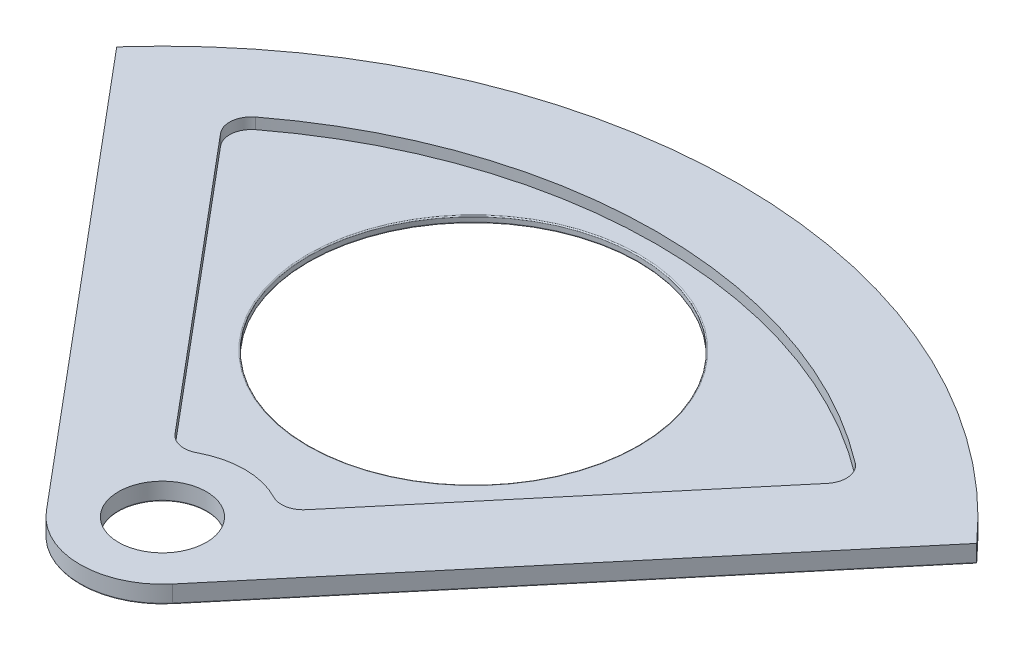
ISO-10303-21;
HEADER;
FILE_DESCRIPTION(('STEP AP214'),'2;1');
FILE_NAME('part.step','',(''),(''),'','','');
FILE_SCHEMA(('AUTOMOTIVE_DESIGN { 1 0 10303 214 1 1 1 1 }'));
ENDSEC;
DATA;
#1=APPLICATION_CONTEXT('core data for automotive mechanical design processes');
#2=APPLICATION_PROTOCOL_DEFINITION('international standard','automotive_design',2000,#1);
#3=PRODUCT_CONTEXT('',#1,'mechanical');
#4=PRODUCT('Part','Part','',(#3));
#5=PRODUCT_RELATED_PRODUCT_CATEGORY('part','',(#4));
#6=PRODUCT_DEFINITION_FORMATION('','',#4);
#7=PRODUCT_DEFINITION_CONTEXT('part definition',#1,'design');
#8=PRODUCT_DEFINITION('design','',#6,#7);
#9=PRODUCT_DEFINITION_SHAPE('','',#8);
#10=(LENGTH_UNIT() NAMED_UNIT(*) SI_UNIT(.MILLI.,.METRE.));
#11=(NAMED_UNIT(*) PLANE_ANGLE_UNIT() SI_UNIT($,.RADIAN.));
#12=(NAMED_UNIT(*) SI_UNIT($,.STERADIAN.) SOLID_ANGLE_UNIT());
#13=UNCERTAINTY_MEASURE_WITH_UNIT(LENGTH_MEASURE(1.E-05),#10,'distance_accuracy_value','');
#14=(GEOMETRIC_REPRESENTATION_CONTEXT(3) GLOBAL_UNCERTAINTY_ASSIGNED_CONTEXT((#13)) GLOBAL_UNIT_ASSIGNED_CONTEXT((#10,
#11,#12)) REPRESENTATION_CONTEXT('',''));
#15=CARTESIAN_POINT('',(0.,0.,0.));
#16=DIRECTION('',(0.,0.,1.));
#17=DIRECTION('',(1.,0.,0.));
#18=AXIS2_PLACEMENT_3D('',#15,#16,#17);
#19=CARTESIAN_POINT('',(-5.55111512312578E-13,2.54,0.));
#20=DIRECTION('',(0.,1.,0.));
#21=DIRECTION('',(0.,0.,1.));
#22=AXIS2_PLACEMENT_3D('',#19,#20,#21);
#23=PLANE('',#22);
#24=DIRECTION('',(0.642787609686541,0.,-0.766044443118977));
#25=VECTOR('',#24,1.);
#26=CARTESIAN_POINT('',(12.2451039645272,2.53999999999895,-14.5931466414165));
#27=LINE('',#26,#25);
#28=CARTESIAN_POINT('',(15.1628474356427,2.54000000000008,-18.070377905385));
#29=VERTEX_POINT('',#28);
#30=CARTESIAN_POINT('',(70.1292829861336,2.53999999999803,-83.5768249447815));
#31=VERTEX_POINT('',#30);
#32=EDGE_CURVE('E372',#29,#31,#27,.T.);
#33=ORIENTED_EDGE('',*,*,#32,.F.);
#34=CARTESIAN_POINT('',(11.2713416645972,2.53999999999958,-21.3357389625926));
#35=DIRECTION('',(0.,1.,0.));
#36=DIRECTION('',(0.,0.,1.));
#37=AXIS2_PLACEMENT_3D('',#34,#35,#36);
#38=CIRCLE('',#37,5.08);
#39=CARTESIAN_POINT('',(8.89842762994542,2.5399999999996,-16.844004444152));
#40=VERTEX_POINT('',#39);
#41=EDGE_CURVE('E342',#29,#40,#38,.F.);
#42=ORIENTED_EDGE('',*,*,#41,.T.);
#43=CARTESIAN_POINT('',(-5.55111512312578E-13,2.54,0.));
#44=DIRECTION('',(0.,-1.,0.));
#45=DIRECTION('',(0.,0.,1.));
#46=AXIS2_PLACEMENT_3D('',#43,#44,#45);
#47=CIRCLE('',#46,19.05);
#48=CARTESIAN_POINT('',(-8.89842762994653,2.54000000000014,-16.844004444152));
#49=VERTEX_POINT('',#48);
#50=EDGE_CURVE('E168',#49,#40,#47,.T.);
#51=ORIENTED_EDGE('',*,*,#50,.F.);
#52=CARTESIAN_POINT('',(-11.2713416645993,2.54000000000067,-21.3357389625927));
#53=DIRECTION('',(0.,1.,0.));
#54=DIRECTION('',(0.,0.,1.));
#55=AXIS2_PLACEMENT_3D('',#52,#53,#54);
#56=CIRCLE('',#55,5.08);
#57=CARTESIAN_POINT('',(-15.1628474356432,2.54000000000056,-18.0703779053851));
#58=VERTEX_POINT('',#57);
#59=EDGE_CURVE('E174',#49,#58,#56,.F.);
#60=ORIENTED_EDGE('',*,*,#59,.T.);
#61=DIRECTION('',(0.642787609686541,0.,0.766044443118977));
#62=VECTOR('',#61,1.);
#63=CARTESIAN_POINT('',(-12.24510396453,2.54000000000056,-14.5931466414165));
#64=LINE('',#63,#62);
#65=CARTESIAN_POINT('',(-70.1292829861355,2.54000000000344,-83.5768249447816));
#66=VERTEX_POINT('',#65);
#67=EDGE_CURVE('E371',#66,#58,#64,.T.);
#68=ORIENTED_EDGE('',*,*,#67,.F.);
#69=CARTESIAN_POINT('',(-66.2377772150904,2.54000000000344,-86.8421860019891));
#70=DIRECTION('',(0.,1.,0.));
#71=DIRECTION('',(0.,0.,1.));
#72=AXIS2_PLACEMENT_3D('',#69,#70,#71);
#73=CIRCLE('',#72,5.08);
#74=CARTESIAN_POINT('',(-69.3186040623036,2.54000000000346,-90.8813574439423));
#75=VERTEX_POINT('',#74);
#76=EDGE_CURVE('E154',#66,#75,#73,.F.);
#77=ORIENTED_EDGE('',*,*,#76,.T.);
#78=CARTESIAN_POINT('',(-5.55111512312578E-13,2.54,0.));
#79=DIRECTION('',(0.,1.,0.));
#80=DIRECTION('',(0.,0.,1.));
#81=AXIS2_PLACEMENT_3D('',#78,#79,#80);
#82=CIRCLE('',#81,114.3);
#83=CARTESIAN_POINT('',(69.3186040623035,2.53999999999804,-90.8813574439422));
#84=VERTEX_POINT('',#83);
#85=EDGE_CURVE('E369',#84,#75,#82,.T.);
#86=ORIENTED_EDGE('',*,*,#85,.F.);
#87=CARTESIAN_POINT('',(66.2377772150899,2.53999999999804,-86.8421860019891));
#88=DIRECTION('',(0.,1.,0.));
#89=DIRECTION('',(0.,0.,1.));
#90=AXIS2_PLACEMENT_3D('',#87,#88,#89);
#91=CIRCLE('',#90,5.08);
#92=EDGE_CURVE('E183',#84,#31,#91,.F.);
#93=ORIENTED_EDGE('',*,*,#92,.T.);
#94=EDGE_LOOP('',(#33,#42,#51,#60,#68,#77,#86,#93));
#95=FACE_BOUND('',#94,.T.);
#96=CARTESIAN_POINT('',(-5.55111512312578E-13,2.54,0.));
#97=DIRECTION('',(0.,1.,0.));
#98=DIRECTION('',(0.,0.,1.));
#99=AXIS2_PLACEMENT_3D('',#96,#97,#98);
#100=CIRCLE('',#99,19.05);
#101=CARTESIAN_POINT('',(-14.5931466414171,2.54000000000031,12.2451039645286));
#102=VERTEX_POINT('',#101);
#103=CARTESIAN_POINT('',(14.5931466414164,2.53999999999933,12.2451039645286));
#104=VERTEX_POINT('',#103);
#105=EDGE_CURVE('E374',#102,#104,#100,.T.);
#106=ORIENTED_EDGE('',*,*,#105,.T.);
#107=DIRECTION('',(0.642787609686541,0.,-0.766044443118977));
#108=VECTOR('',#107,1.);
#109=CARTESIAN_POINT('',(14.5931466414164,2.53999999999933,12.2451039645286));
#110=LINE('',#109,#108);
#111=CARTESIAN_POINT('',(99.429715483523,2.53999999999695,-88.8591817364174));
#112=VERTEX_POINT('',#111);
#113=EDGE_CURVE('E384',#104,#112,#110,.T.);
#114=ORIENTED_EDGE('',*,*,#113,.T.);
#115=CARTESIAN_POINT('',(-5.55111512312578E-13,2.54,0.));
#116=DIRECTION('',(0.,1.,0.));
#117=DIRECTION('',(0.,0.,-1.));
#118=AXIS2_PLACEMENT_3D('',#115,#116,#117);
#119=CIRCLE('',#118,133.35);
#120=CARTESIAN_POINT('',(-99.4297154835231,2.54000000000508,-88.8591817364174));
#121=VERTEX_POINT('',#120);
#122=EDGE_CURVE('E386',#112,#121,#119,.T.);
#123=ORIENTED_EDGE('',*,*,#122,.T.);
#124=DIRECTION('',(0.642787609686541,0.,0.766044443118977));
#125=VECTOR('',#124,1.);
#126=CARTESIAN_POINT('',(-14.5931466414171,2.54000000000031,12.2451039645286));
#127=LINE('',#126,#125);
#128=EDGE_CURVE('E388',#121,#102,#127,.T.);
#129=ORIENTED_EDGE('',*,*,#128,.T.);
#130=EDGE_LOOP('',(#106,#114,#123,#129));
#131=FACE_BOUND('',#130,.T.);
#132=CARTESIAN_POINT('',(-5.55111512312578E-13,2.54,0.));
#133=DIRECTION('',(0.,1.,0.));
#134=DIRECTION('',(0.,0.,1.));
#135=AXIS2_PLACEMENT_3D('',#132,#133,#134);
#136=CIRCLE('',#135,10.16);
#137=CARTESIAN_POINT('',(-5.55111512312579E-13,2.53999999999991,10.16));
#138=VERTEX_POINT('',#137);
#139=EDGE_CURVE('E379',#138,#138,#136,.T.);
#140=ORIENTED_EDGE('',*,*,#139,.F.);
#141=EDGE_LOOP('',(#140));
#142=FACE_BOUND('',#141,.T.);
#143=ADVANCED_FACE('F36',(#95,#131,#142),#23,.T.);
#144=CARTESIAN_POINT('',(-5.55111512312578E-13,2.54,0.));
#145=DIRECTION('',(0.,-1.,0.));
#146=DIRECTION('',(0.,0.,-1.));
#147=AXIS2_PLACEMENT_3D('',#144,#145,#146);
#148=CYLINDRICAL_SURFACE('',#147,19.05);
#149=DIRECTION('',(0.,-1.,0.));
#150=VECTOR('',#149,1.);
#151=CARTESIAN_POINT('',(-14.5931466414171,2.54000000000031,12.2451039645286));
#152=LINE('',#151,#150);
#153=CARTESIAN_POINT('',(-14.5931466414165,-1.2699999999997,12.2451039645286));
#154=VERTEX_POINT('',#153);
#155=EDGE_CURVE('E390',#102,#154,#152,.T.);
#156=ORIENTED_EDGE('',*,*,#155,.T.);
#157=CARTESIAN_POINT('',(0.,-1.26999999999999,-1.2490009027033E-13));
#158=DIRECTION('',(0.,-1.,0.));
#159=DIRECTION('',(1.,0.,0.));
#160=AXIS2_PLACEMENT_3D('',#157,#158,#159);
#161=CIRCLE('',#160,19.05);
#162=CARTESIAN_POINT('',(14.5931466414165,-1.27000000000066,12.2451039645286));
#163=VERTEX_POINT('',#162);
#164=EDGE_CURVE('E211',#154,#163,#161,.F.);
#165=ORIENTED_EDGE('',*,*,#164,.T.);
#166=DIRECTION('',(0.,-1.,0.));
#167=VECTOR('',#166,1.);
#168=CARTESIAN_POINT('',(14.5931466414164,2.53999999999933,12.2451039645286));
#169=LINE('',#168,#167);
#170=EDGE_CURVE('E357',#104,#163,#169,.T.);
#171=ORIENTED_EDGE('',*,*,#170,.F.);
#172=ORIENTED_EDGE('',*,*,#105,.F.);
#173=EDGE_LOOP('',(#156,#165,#171,#172));
#174=FACE_BOUND('',#173,.T.);
#175=ADVANCED_FACE('F250',(#174),#148,.T.);
#176=CARTESIAN_POINT('',(14.5931466414164,2.53999999999933,12.2451039645286));
#177=DIRECTION('',(-0.766044443118977,0.,-0.642787609686541));
#178=DIRECTION('',(-0.642787609686541,0.,0.766044443118977));
#179=AXIS2_PLACEMENT_3D('',#176,#177,#178);
#180=PLANE('',#179);
#181=ORIENTED_EDGE('',*,*,#170,.T.);
#182=DIRECTION('',(-0.642787609686541,0.,0.766044443118977));
#183=VECTOR('',#182,1.);
#184=CARTESIAN_POINT('',(99.429715483523,-1.27000000000306,-88.8591817364173));
#185=LINE('',#184,#183);
#186=CARTESIAN_POINT('',(99.429715483523,-1.27000000000306,-88.8591817364173));
#187=VERTEX_POINT('',#186);
#188=EDGE_CURVE('E206',#163,#187,#185,.F.);
#189=ORIENTED_EDGE('',*,*,#188,.T.);
#190=DIRECTION('',(0.,-1.,0.));
#191=VECTOR('',#190,1.);
#192=CARTESIAN_POINT('',(99.429715483523,2.53999999999695,-88.8591817364174));
#193=LINE('',#192,#191);
#194=EDGE_CURVE('E361',#112,#187,#193,.T.);
#195=ORIENTED_EDGE('',*,*,#194,.F.);
#196=ORIENTED_EDGE('',*,*,#113,.F.);
#197=EDGE_LOOP('',(#181,#189,#195,#196));
#198=FACE_BOUND('',#197,.T.);
#199=ADVANCED_FACE('F256',(#198),#180,.F.);
#200=CARTESIAN_POINT('',(-5.55111512312578E-13,2.54,0.));
#201=DIRECTION('',(0.,-1.,0.));
#202=DIRECTION('',(0.,0.,-1.));
#203=AXIS2_PLACEMENT_3D('',#200,#201,#202);
#204=CYLINDRICAL_SURFACE('',#203,133.35);
#205=ORIENTED_EDGE('',*,*,#194,.T.);
#206=CARTESIAN_POINT('',(0.,-1.26999999999999,-1.2490009027033E-13));
#207=DIRECTION('',(0.,-1.,0.));
#208=DIRECTION('',(1.,0.,0.));
#209=AXIS2_PLACEMENT_3D('',#206,#207,#208);
#210=CIRCLE('',#209,133.35);
#211=CARTESIAN_POINT('',(-99.4297154835231,-1.26999999999493,-88.8591817364173));
#212=VERTEX_POINT('',#211);
#213=EDGE_CURVE('E67',#187,#212,#210,.F.);
#214=ORIENTED_EDGE('',*,*,#213,.T.);
#215=DIRECTION('',(0.,-1.,0.));
#216=VECTOR('',#215,1.);
#217=CARTESIAN_POINT('',(-99.4297154835231,2.54000000000508,-88.8591817364174));
#218=LINE('',#217,#216);
#219=EDGE_CURVE('E392',#121,#212,#218,.T.);
#220=ORIENTED_EDGE('',*,*,#219,.F.);
#221=ORIENTED_EDGE('',*,*,#122,.F.);
#222=EDGE_LOOP('',(#205,#214,#220,#221));
#223=FACE_BOUND('',#222,.T.);
#224=ADVANCED_FACE('F268',(#223),#204,.T.);
#225=CARTESIAN_POINT('',(-14.5931466414171,2.54000000000031,12.2451039645286));
#226=DIRECTION('',(0.766044443118977,0.,-0.642787609686541));
#227=DIRECTION('',(-0.642787609686541,0.,-0.766044443118977));
#228=AXIS2_PLACEMENT_3D('',#225,#226,#227);
#229=PLANE('',#228);
#230=ORIENTED_EDGE('',*,*,#219,.T.);
#231=DIRECTION('',(-0.642787609686541,0.,-0.766044443118977));
#232=VECTOR('',#231,1.);
#233=CARTESIAN_POINT('',(-14.5931466414165,-1.2699999999997,12.2451039645286));
#234=LINE('',#233,#232);
#235=EDGE_CURVE('E59',#212,#154,#234,.F.);
#236=ORIENTED_EDGE('',*,*,#235,.T.);
#237=ORIENTED_EDGE('',*,*,#155,.F.);
#238=ORIENTED_EDGE('',*,*,#128,.F.);
#239=EDGE_LOOP('',(#230,#236,#237,#238));
#240=FACE_BOUND('',#239,.T.);
#241=ADVANCED_FACE('F265',(#240),#229,.F.);
#242=CARTESIAN_POINT('',(-5.55111512312578E-13,2.54,0.));
#243=DIRECTION('',(0.,-1.,0.));
#244=DIRECTION('',(0.,0.,-1.));
#245=AXIS2_PLACEMENT_3D('',#242,#243,#244);
#246=CYLINDRICAL_SURFACE('',#245,19.05);
#247=ORIENTED_EDGE('',*,*,#50,.T.);
#248=DIRECTION('',(0.,-1.,0.));
#249=VECTOR('',#248,1.);
#250=CARTESIAN_POINT('',(8.89842762994542,2.5399999999996,-16.844004444152));
#251=LINE('',#250,#249);
#252=CARTESIAN_POINT('',(8.89842762994597,-4.02455846426619E-13,-16.844004444152));
#253=VERTEX_POINT('',#252);
#254=EDGE_CURVE('E356',#40,#253,#251,.T.);
#255=ORIENTED_EDGE('',*,*,#254,.T.);
#256=CARTESIAN_POINT('',(0.,0.,0.));
#257=DIRECTION('',(0.,-1.,0.));
#258=DIRECTION('',(0.,0.,1.));
#259=AXIS2_PLACEMENT_3D('',#256,#257,#258);
#260=CIRCLE('',#259,19.05);
#261=CARTESIAN_POINT('',(-8.89842762994597,1.38777878078145E-13,-16.844004444152));
#262=VERTEX_POINT('',#261);
#263=EDGE_CURVE('E336',#262,#253,#260,.T.);
#264=ORIENTED_EDGE('',*,*,#263,.F.);
#265=DIRECTION('',(0.,-1.,0.));
#266=VECTOR('',#265,1.);
#267=CARTESIAN_POINT('',(-8.89842762994653,2.54000000000014,-16.844004444152));
#268=LINE('',#267,#266);
#269=EDGE_CURVE('E353',#262,#49,#268,.F.);
#270=ORIENTED_EDGE('',*,*,#269,.T.);
#271=EDGE_LOOP('',(#247,#255,#264,#270));
#272=FACE_BOUND('',#271,.T.);
#273=ADVANCED_FACE('F263',(#272),#246,.T.);
#274=CARTESIAN_POINT('',(12.2451039645272,2.53999999999895,-14.5931466414165));
#275=DIRECTION('',(-0.766044443118977,0.,-0.642787609686541));
#276=DIRECTION('',(-0.642787609686541,0.,0.766044443118977));
#277=AXIS2_PLACEMENT_3D('',#274,#275,#276);
#278=PLANE('',#277);
#279=DIRECTION('',(0.642787609686541,0.,-0.766044443118977));
#280=VECTOR('',#279,1.);
#281=CARTESIAN_POINT('',(12.2451039645276,-1.06858966120171E-12,-14.5931466414165));
#282=LINE('',#281,#280);
#283=CARTESIAN_POINT('',(15.1628474356426,-4.16333634234434E-13,-18.0703779053849));
#284=VERTEX_POINT('',#283);
#285=CARTESIAN_POINT('',(70.1292829861336,-1.98452365651747E-12,-83.5768249447815));
#286=VERTEX_POINT('',#285);
#287=EDGE_CURVE('E330',#284,#286,#282,.T.);
#288=ORIENTED_EDGE('',*,*,#287,.F.);
#289=DIRECTION('',(0.,1.,0.));
#290=VECTOR('',#289,1.);
#291=CARTESIAN_POINT('',(15.1628474356427,2.54000000000008,-18.070377905385));
#292=LINE('',#291,#290);
#293=EDGE_CURVE('E159',#284,#29,#292,.T.);
#294=ORIENTED_EDGE('',*,*,#293,.T.);
#295=ORIENTED_EDGE('',*,*,#32,.T.);
#296=DIRECTION('',(0.,1.,0.));
#297=VECTOR('',#296,1.);
#298=CARTESIAN_POINT('',(70.1292829861336,-1.98452365651747E-12,-83.5768249447815));
#299=LINE('',#298,#297);
#300=EDGE_CURVE('E334',#31,#286,#299,.F.);
#301=ORIENTED_EDGE('',*,*,#300,.T.);
#302=EDGE_LOOP('',(#288,#294,#295,#301));
#303=FACE_BOUND('',#302,.T.);
#304=ADVANCED_FACE('F320',(#303),#278,.T.);
#305=CARTESIAN_POINT('',(-5.55111512312578E-13,2.54,0.));
#306=DIRECTION('',(0.,-1.,0.));
#307=DIRECTION('',(0.,0.,-1.));
#308=AXIS2_PLACEMENT_3D('',#305,#306,#307);
#309=CYLINDRICAL_SURFACE('',#308,114.3);
#310=ORIENTED_EDGE('',*,*,#85,.T.);
#311=DIRECTION('',(0.,-1.,0.));
#312=VECTOR('',#311,1.);
#313=CARTESIAN_POINT('',(-69.3186040623036,2.54000000000346,-90.8813574439422));
#314=LINE('',#313,#312);
#315=CARTESIAN_POINT('',(-69.3186040623036,3.44169137633799E-12,-90.8813574439423));
#316=VERTEX_POINT('',#315);
#317=EDGE_CURVE('E345',#75,#316,#314,.T.);
#318=ORIENTED_EDGE('',*,*,#317,.T.);
#319=CARTESIAN_POINT('',(0.,0.,0.));
#320=DIRECTION('',(0.,1.,0.));
#321=DIRECTION('',(0.,0.,1.));
#322=AXIS2_PLACEMENT_3D('',#319,#320,#321);
#323=CIRCLE('',#322,114.3);
#324=CARTESIAN_POINT('',(69.3186040623036,-1.95676808090184E-12,-90.8813574439422));
#325=VERTEX_POINT('',#324);
#326=EDGE_CURVE('E169',#325,#316,#323,.T.);
#327=ORIENTED_EDGE('',*,*,#326,.F.);
#328=DIRECTION('',(0.,-1.,0.));
#329=VECTOR('',#328,1.);
#330=CARTESIAN_POINT('',(69.3186040623035,2.53999999999804,-90.8813574439422));
#331=LINE('',#330,#329);
#332=EDGE_CURVE('E348',#325,#84,#331,.F.);
#333=ORIENTED_EDGE('',*,*,#332,.T.);
#334=EDGE_LOOP('',(#310,#318,#327,#333));
#335=FACE_BOUND('',#334,.T.);
#336=ADVANCED_FACE('F318',(#335),#309,.F.);
#337=CARTESIAN_POINT('',(-12.24510396453,2.54000000000056,-14.5931466414165));
#338=DIRECTION('',(0.766044443118977,0.,-0.642787609686541));
#339=DIRECTION('',(-0.642787609686541,0.,-0.766044443118977));
#340=AXIS2_PLACEMENT_3D('',#337,#338,#339);
#341=PLANE('',#340);
#342=ORIENTED_EDGE('',*,*,#67,.T.);
#343=DIRECTION('',(0.,1.,0.));
#344=VECTOR('',#343,1.);
#345=CARTESIAN_POINT('',(-15.1628474356421,5.41233724504764E-13,-18.070377905385));
#346=LINE('',#345,#344);
#347=CARTESIAN_POINT('',(-15.1628474356421,5.41233724504764E-13,-18.070377905385));
#348=VERTEX_POINT('',#347);
#349=EDGE_CURVE('E158',#58,#348,#346,.F.);
#350=ORIENTED_EDGE('',*,*,#349,.T.);
#351=DIRECTION('',(0.642787609686541,0.,0.766044443118977));
#352=VECTOR('',#351,1.);
#353=CARTESIAN_POINT('',(-12.2451039645296,5.68989300120393E-13,-14.5931466414167));
#354=LINE('',#353,#352);
#355=CARTESIAN_POINT('',(-70.1292829861355,3.42781358853017E-12,-83.5768249447815));
#356=VERTEX_POINT('',#355);
#357=EDGE_CURVE('E163',#356,#348,#354,.T.);
#358=ORIENTED_EDGE('',*,*,#357,.F.);
#359=DIRECTION('',(0.,1.,0.));
#360=VECTOR('',#359,1.);
#361=CARTESIAN_POINT('',(-70.1292829861355,2.54000000000344,-83.5768249447816));
#362=LINE('',#361,#360);
#363=EDGE_CURVE('E147',#356,#66,#362,.T.);
#364=ORIENTED_EDGE('',*,*,#363,.T.);
#365=EDGE_LOOP('',(#342,#350,#358,#364));
#366=FACE_BOUND('',#365,.T.);
#367=ADVANCED_FACE('F164',(#366),#341,.T.);
#368=CARTESIAN_POINT('',(-5.55111512312578E-13,2.54,0.));
#369=DIRECTION('',(0.,-1.,0.));
#370=DIRECTION('',(0.,0.,-1.));
#371=AXIS2_PLACEMENT_3D('',#368,#369,#370);
#372=CYLINDRICAL_SURFACE('',#371,10.16);
#373=CARTESIAN_POINT('',(0.,-1.26999999999999,-1.2490009027033E-13));
#374=DIRECTION('',(0.,-1.,0.));
#375=DIRECTION('',(1.,0.,0.));
#376=AXIS2_PLACEMENT_3D('',#373,#374,#375);
#377=CIRCLE('',#376,10.16);
#378=CARTESIAN_POINT('',(10.16,-1.27000000000039,-1.24900090270327E-13));
#379=VERTEX_POINT('',#378);
#380=EDGE_CURVE('E51',#379,#379,#377,.T.);
#381=ORIENTED_EDGE('',*,*,#380,.T.);
#382=EDGE_LOOP('',(#381));
#383=FACE_BOUND('',#382,.T.);
#384=ORIENTED_EDGE('',*,*,#139,.T.);
#385=EDGE_LOOP('',(#384));
#386=FACE_BOUND('',#385,.T.);
#387=ADVANCED_FACE('F278',(#383,#386),#372,.F.);
#388=CARTESIAN_POINT('',(11.2713416645972,2.53999999999958,-21.3357389625926));
#389=DIRECTION('',(0.,-1.,0.));
#390=DIRECTION('',(0.,0.,-1.));
#391=AXIS2_PLACEMENT_3D('',#388,#389,#390);
#392=CYLINDRICAL_SURFACE('',#391,5.08);
#393=ORIENTED_EDGE('',*,*,#41,.F.);
#394=ORIENTED_EDGE('',*,*,#293,.F.);
#395=CARTESIAN_POINT('',(11.2713416645968,-4.16333634234434E-13,-21.3357389625926));
#396=DIRECTION('',(0.,1.,0.));
#397=DIRECTION('',(0.,0.,1.));
#398=AXIS2_PLACEMENT_3D('',#395,#396,#397);
#399=CIRCLE('',#398,5.08);
#400=EDGE_CURVE('E340',#253,#284,#399,.T.);
#401=ORIENTED_EDGE('',*,*,#400,.F.);
#402=ORIENTED_EDGE('',*,*,#254,.F.);
#403=EDGE_LOOP('',(#393,#394,#401,#402));
#404=FACE_BOUND('',#403,.T.);
#405=ADVANCED_FACE('F274',(#404),#392,.F.);
#406=CARTESIAN_POINT('',(-11.2713416645993,2.54000000000067,-21.3357389625927));
#407=DIRECTION('',(0.,-1.,0.));
#408=DIRECTION('',(0.,0.,-1.));
#409=AXIS2_PLACEMENT_3D('',#406,#407,#408);
#410=CYLINDRICAL_SURFACE('',#409,5.08);
#411=ORIENTED_EDGE('',*,*,#59,.F.);
#412=ORIENTED_EDGE('',*,*,#269,.F.);
#413=CARTESIAN_POINT('',(-11.2713416645998,6.66133814775094E-13,-21.3357389625926));
#414=DIRECTION('',(0.,1.,0.));
#415=DIRECTION('',(0.,0.,1.));
#416=AXIS2_PLACEMENT_3D('',#413,#414,#415);
#417=CIRCLE('',#416,5.08);
#418=EDGE_CURVE('E178',#348,#262,#417,.T.);
#419=ORIENTED_EDGE('',*,*,#418,.F.);
#420=ORIENTED_EDGE('',*,*,#349,.F.);
#421=EDGE_LOOP('',(#411,#412,#419,#420));
#422=FACE_BOUND('',#421,.T.);
#423=ADVANCED_FACE('F277',(#422),#410,.F.);
#424=CARTESIAN_POINT('',(-66.2377772150904,2.54000000000344,-86.8421860019891));
#425=DIRECTION('',(0.,-1.,0.));
#426=DIRECTION('',(0.,0.,-1.));
#427=AXIS2_PLACEMENT_3D('',#424,#425,#426);
#428=CYLINDRICAL_SURFACE('',#427,5.08);
#429=ORIENTED_EDGE('',*,*,#76,.F.);
#430=ORIENTED_EDGE('',*,*,#363,.F.);
#431=CARTESIAN_POINT('',(-66.2377772150904,3.42781358853017E-12,-86.8421860019892));
#432=DIRECTION('',(0.,1.,0.));
#433=DIRECTION('',(0.,0.,1.));
#434=AXIS2_PLACEMENT_3D('',#431,#432,#433);
#435=CIRCLE('',#434,5.08);
#436=EDGE_CURVE('E152',#316,#356,#435,.T.);
#437=ORIENTED_EDGE('',*,*,#436,.F.);
#438=ORIENTED_EDGE('',*,*,#317,.F.);
#439=EDGE_LOOP('',(#429,#430,#437,#438));
#440=FACE_BOUND('',#439,.T.);
#441=ADVANCED_FACE('F149',(#440),#428,.F.);
#442=CARTESIAN_POINT('',(66.2377772150899,2.53999999999804,-86.8421860019891));
#443=DIRECTION('',(0.,-1.,0.));
#444=DIRECTION('',(0.,0.,-1.));
#445=AXIS2_PLACEMENT_3D('',#442,#443,#444);
#446=CYLINDRICAL_SURFACE('',#445,5.08);
#447=ORIENTED_EDGE('',*,*,#92,.F.);
#448=ORIENTED_EDGE('',*,*,#332,.F.);
#449=CARTESIAN_POINT('',(66.2377772150899,-1.95676808090184E-12,-86.8421860019891));
#450=DIRECTION('',(0.,1.,0.));
#451=DIRECTION('',(0.,0.,1.));
#452=AXIS2_PLACEMENT_3D('',#449,#450,#451);
#453=CIRCLE('',#452,5.08);
#454=EDGE_CURVE('E176',#286,#325,#453,.T.);
#455=ORIENTED_EDGE('',*,*,#454,.F.);
#456=ORIENTED_EDGE('',*,*,#300,.F.);
#457=EDGE_LOOP('',(#447,#448,#455,#456));
#458=FACE_BOUND('',#457,.T.);
#459=ADVANCED_FACE('F285',(#458),#446,.F.);
#460=CARTESIAN_POINT('',(0.,0.,0.));
#461=DIRECTION('',(0.,-1.,0.));
#462=DIRECTION('',(1.,0.,0.));
#463=AXIS2_PLACEMENT_3D('',#460,#461,#462);
#464=PLANE('',#463);
#465=CARTESIAN_POINT('',(0.,6.24500451351651E-13,-71.891985058765));
#466=DIRECTION('',(0.,-1.,0.));
#467=DIRECTION('',(1.,0.,0.));
#468=AXIS2_PLACEMENT_3D('',#465,#466,#467);
#469=CIRCLE('',#468,38.354);
#470=CARTESIAN_POINT('',(38.354,-8.70109984063578E-13,-71.891985058765));
#471=VERTEX_POINT('',#470);
#472=EDGE_CURVE('E11',#471,#471,#469,.T.);
#473=ORIENTED_EDGE('',*,*,#472,.T.);
#474=EDGE_LOOP('',(#473));
#475=FACE_BOUND('',#474,.T.);
#476=ORIENTED_EDGE('',*,*,#436,.T.);
#477=ORIENTED_EDGE('',*,*,#357,.T.);
#478=ORIENTED_EDGE('',*,*,#418,.T.);
#479=ORIENTED_EDGE('',*,*,#263,.T.);
#480=ORIENTED_EDGE('',*,*,#400,.T.);
#481=ORIENTED_EDGE('',*,*,#287,.T.);
#482=ORIENTED_EDGE('',*,*,#454,.T.);
#483=ORIENTED_EDGE('',*,*,#326,.T.);
#484=EDGE_LOOP('',(#476,#477,#478,#479,#480,#481,#482,#483));
#485=FACE_BOUND('',#484,.T.);
#486=ADVANCED_FACE('F172',(#475,#485),#464,.F.);
#487=CARTESIAN_POINT('',(5.55111512312578E-13,-1.524,0.));
#488=DIRECTION('',(0.,-1.,0.));
#489=DIRECTION('',(1.,0.,0.));
#490=AXIS2_PLACEMENT_3D('',#487,#488,#489);
#491=PLANE('',#490);
#492=CARTESIAN_POINT('',(0.,-1.5239999999994,-71.891985058765));
#493=DIRECTION('',(0.,-1.,0.));
#494=DIRECTION('',(1.,0.,0.));
#495=AXIS2_PLACEMENT_3D('',#492,#493,#494);
#496=CIRCLE('',#495,38.354);
#497=CARTESIAN_POINT('',(38.354,-1.5240000000009,-71.891985058765));
#498=VERTEX_POINT('',#497);
#499=EDGE_CURVE('E203',#498,#498,#496,.F.);
#500=ORIENTED_EDGE('',*,*,#499,.T.);
#501=EDGE_LOOP('',(#500));
#502=FACE_BOUND('',#501,.T.);
#503=CARTESIAN_POINT('',(5.55111512312578E-13,-1.524,0.));
#504=DIRECTION('',(0.,-1.,0.));
#505=DIRECTION('',(1.,0.,0.));
#506=AXIS2_PLACEMENT_3D('',#503,#504,#505);
#507=CIRCLE('',#506,133.096);
#508=CARTESIAN_POINT('',(-99.0936278882084,-1.52399999999492,-88.8538019892975));
#509=VERTEX_POINT('',#508);
#510=CARTESIAN_POINT('',(99.0936278882083,-1.52400000000305,-88.8538019892974));
#511=VERTEX_POINT('',#510);
#512=EDGE_CURVE('E198',#509,#511,#507,.T.);
#513=ORIENTED_EDGE('',*,*,#512,.T.);
#514=DIRECTION('',(-0.642787609686541,0.,0.766044443118977));
#515=VECTOR('',#514,1.);
#516=CARTESIAN_POINT('',(14.3985713528648,-1.5240000000012,12.0818359116681));
#517=LINE('',#516,#515);
#518=CARTESIAN_POINT('',(14.3985713528648,-1.5240000000012,12.0818359116681));
#519=VERTEX_POINT('',#518);
#520=EDGE_CURVE('E200',#511,#519,#517,.T.);
#521=ORIENTED_EDGE('',*,*,#520,.T.);
#522=CARTESIAN_POINT('',(5.55111512312578E-13,-1.524,0.));
#523=DIRECTION('',(0.,-1.,0.));
#524=DIRECTION('',(1.,0.,0.));
#525=AXIS2_PLACEMENT_3D('',#522,#523,#524);
#526=CIRCLE('',#525,18.796);
#527=CARTESIAN_POINT('',(-14.3985713528643,-1.52399999999971,12.0818359116682));
#528=VERTEX_POINT('',#527);
#529=EDGE_CURVE('E194',#519,#528,#526,.T.);
#530=ORIENTED_EDGE('',*,*,#529,.T.);
#531=DIRECTION('',(-0.642787609686541,0.,-0.766044443118977));
#532=VECTOR('',#531,1.);
#533=CARTESIAN_POINT('',(-99.2351401949708,-1.52399999999492,-89.0224497892779));
#534=LINE('',#533,#532);
#535=EDGE_CURVE('E196',#528,#509,#534,.T.);
#536=ORIENTED_EDGE('',*,*,#535,.T.);
#537=EDGE_LOOP('',(#513,#521,#530,#536));
#538=FACE_BOUND('',#537,.T.);
#539=CARTESIAN_POINT('',(5.55111512312578E-13,-1.524,0.));
#540=DIRECTION('',(0.,-1.,0.));
#541=DIRECTION('',(1.,0.,0.));
#542=AXIS2_PLACEMENT_3D('',#539,#540,#541);
#543=CIRCLE('',#542,10.414);
#544=CARTESIAN_POINT('',(10.4140000000006,-1.5240000000004,0.));
#545=VERTEX_POINT('',#544);
#546=EDGE_CURVE('E191',#545,#545,#543,.F.);
#547=ORIENTED_EDGE('',*,*,#546,.T.);
#548=EDGE_LOOP('',(#547));
#549=FACE_BOUND('',#548,.T.);
#550=ADVANCED_FACE('F294',(#502,#538,#549),#491,.T.);
#551=CARTESIAN_POINT('',(0.,-1.5239999999994,-71.891985058765));
#552=DIRECTION('',(0.,1.,0.));
#553=DIRECTION('',(-1.,0.,0.));
#554=AXIS2_PLACEMENT_3D('',#551,#552,#553);
#555=CYLINDRICAL_SURFACE('',#554,38.1);
#556=CARTESIAN_POINT('',(0.,-1.26999999999942,-71.891985058765));
#557=DIRECTION('',(0.,-1.,0.));
#558=DIRECTION('',(1.,0.,0.));
#559=AXIS2_PLACEMENT_3D('',#556,#557,#558);
#560=CIRCLE('',#559,38.1);
#561=CARTESIAN_POINT('',(-38.1,-1.27000000000091,-71.891985058765));
#562=VERTEX_POINT('',#561);
#563=EDGE_CURVE('E188',#562,#562,#560,.T.);
#564=CARTESIAN_POINT('',(0.,-0.25399999999938,-71.8919850587649));
#565=DIRECTION('',(0.,-1.,0.));
#566=DIRECTION('',(1.,0.,0.));
#567=AXIS2_PLACEMENT_3D('',#564,#565,#566);
#568=CIRCLE('',#567,38.1);
#569=CARTESIAN_POINT('',(-38.1000000000001,-0.254000000000865,-71.891985058765));
#570=VERTEX_POINT('',#569);
#571=EDGE_CURVE('E185',#570,#570,#568,.F.);
#572=CARTESIAN_POINT('',(-38.1,-1.27000000000091,-71.891985058765));
#573=CARTESIAN_POINT('',(-38.1,-1.25941666666758,-71.891985058765));
#574=CARTESIAN_POINT('',(-38.1,-1.24883333333424,-71.891985058765));
#575=CARTESIAN_POINT('',(-38.1,-1.22766666666757,-71.891985058765));
#576=CARTESIAN_POINT('',(-38.1,-1.21708333333424,-71.891985058765));
#577=CARTESIAN_POINT('',(-38.1,-1.19591666666757,-71.891985058765));
#578=CARTESIAN_POINT('',(-38.1,-1.18533333333424,-71.891985058765));
#579=CARTESIAN_POINT('',(-38.1,-1.16416666666757,-71.891985058765));
#580=CARTESIAN_POINT('',(-38.1,-1.15358333333424,-71.891985058765));
#581=CARTESIAN_POINT('',(-38.1,-1.13241666666757,-71.891985058765));
#582=CARTESIAN_POINT('',(-38.1,-1.12183333333424,-71.891985058765));
#583=CARTESIAN_POINT('',(-38.1,-1.10066666666757,-71.891985058765));
#584=CARTESIAN_POINT('',(-38.1,-1.09008333333423,-71.891985058765));
#585=CARTESIAN_POINT('',(-38.1,-1.06891666666757,-71.891985058765));
#586=CARTESIAN_POINT('',(-38.1,-1.05833333333423,-71.891985058765));
#587=CARTESIAN_POINT('',(-38.1,-1.03716666666757,-71.891985058765));
#588=CARTESIAN_POINT('',(-38.1,-1.02658333333423,-71.891985058765));
#589=CARTESIAN_POINT('',(-38.1,-1.00541666666756,-71.891985058765));
#590=CARTESIAN_POINT('',(-38.1,-0.994833333334231,-71.891985058765));
#591=CARTESIAN_POINT('',(-38.1,-0.973666666667563,-71.891985058765));
#592=CARTESIAN_POINT('',(-38.1,-0.963083333334229,-71.891985058765));
#593=CARTESIAN_POINT('',(-38.1,-0.941916666667561,-71.891985058765));
#594=CARTESIAN_POINT('',(-38.1,-0.931333333334228,-71.891985058765));
#595=CARTESIAN_POINT('',(-38.1,-0.91016666666756,-71.891985058765));
#596=CARTESIAN_POINT('',(-38.1,-0.899583333334226,-71.891985058765));
#597=CARTESIAN_POINT('',(-38.1,-0.878416666667559,-71.891985058765));
#598=CARTESIAN_POINT('',(-38.1,-0.867833333334225,-71.891985058765));
#599=CARTESIAN_POINT('',(-38.1,-0.846666666667557,-71.891985058765));
#600=CARTESIAN_POINT('',(-38.1,-0.836083333334223,-71.891985058765));
#601=CARTESIAN_POINT('',(-38.1,-0.814916666667556,-71.891985058765));
#602=CARTESIAN_POINT('',(-38.1,-0.804333333334222,-71.891985058765));
#603=CARTESIAN_POINT('',(-38.1,-0.783166666667554,-71.891985058765));
#604=CARTESIAN_POINT('',(-38.1,-0.772583333334221,-71.891985058765));
#605=CARTESIAN_POINT('',(-38.1,-0.751416666667553,-71.891985058765));
#606=CARTESIAN_POINT('',(-38.1,-0.740833333334219,-71.891985058765));
#607=CARTESIAN_POINT('',(-38.1,-0.719666666667552,-71.891985058765));
#608=CARTESIAN_POINT('',(-38.1,-0.709083333334218,-71.891985058765));
#609=CARTESIAN_POINT('',(-38.1,-0.68791666666755,-71.891985058765));
#610=CARTESIAN_POINT('',(-38.1,-0.677333333334217,-71.891985058765));
#611=CARTESIAN_POINT('',(-38.1,-0.656166666667549,-71.891985058765));
#612=CARTESIAN_POINT('',(-38.1,-0.645583333334215,-71.891985058765));
#613=CARTESIAN_POINT('',(-38.1,-0.624416666667547,-71.891985058765));
#614=CARTESIAN_POINT('',(-38.1,-0.613833333334214,-71.891985058765));
#615=CARTESIAN_POINT('',(-38.1,-0.592666666667546,-71.891985058765));
#616=CARTESIAN_POINT('',(-38.1,-0.582083333334212,-71.891985058765));
#617=CARTESIAN_POINT('',(-38.1,-0.560916666667545,-71.891985058765));
#618=CARTESIAN_POINT('',(-38.1,-0.550333333334211,-71.891985058765));
#619=CARTESIAN_POINT('',(-38.1,-0.529166666667543,-71.891985058765));
#620=CARTESIAN_POINT('',(-38.1,-0.51858333333421,-71.891985058765));
#621=CARTESIAN_POINT('',(-38.1,-0.497416666667542,-71.891985058765));
#622=CARTESIAN_POINT('',(-38.1,-0.486833333334208,-71.891985058765));
#623=CARTESIAN_POINT('',(-38.1,-0.465666666667541,-71.891985058765));
#624=CARTESIAN_POINT('',(-38.1,-0.455083333334207,-71.891985058765));
#625=CARTESIAN_POINT('',(-38.1,-0.433916666667539,-71.891985058765));
#626=CARTESIAN_POINT('',(-38.1,-0.423333333334205,-71.891985058765));
#627=CARTESIAN_POINT('',(-38.1,-0.402166666667538,-71.891985058765));
#628=CARTESIAN_POINT('',(-38.1,-0.391583333334204,-71.891985058765));
#629=CARTESIAN_POINT('',(-38.1,-0.370416666667536,-71.891985058765));
#630=CARTESIAN_POINT('',(-38.1000000000001,-0.359833333334203,-71.891985058765));
#631=CARTESIAN_POINT('',(-38.1000000000001,-0.338666666667535,-71.891985058765));
#632=CARTESIAN_POINT('',(-38.1000000000001,-0.328083333334201,-71.891985058765));
#633=CARTESIAN_POINT('',(-38.1000000000001,-0.306916666667534,-71.891985058765));
#634=CARTESIAN_POINT('',(-38.1000000000001,-0.2963333333342,-71.891985058765));
#635=CARTESIAN_POINT('',(-38.1000000000001,-0.275166666667532,-71.891985058765));
#636=CARTESIAN_POINT('',(-38.1000000000001,-0.264583333334198,-71.891985058765));
#637=CARTESIAN_POINT('',(-38.1000000000001,-0.254000000000865,-71.891985058765));
#638=B_SPLINE_CURVE_WITH_KNOTS('',3,(#572,#573,#574,#575,#576,#577,#578,#579,#580,#581,#582,
#583,#584,#585,#586,#587,#588,#589,#590,#591,#592,#593,#594,#595,#596,#597,#598,#599,#600,#601,
#602,#603,#604,#605,#606,#607,#608,#609,#610,#611,#612,#613,#614,#615,#616,#617,#618,#619,#620,
#621,#622,#623,#624,#625,#626,#627,#628,#629,#630,#631,#632,#633,#634,#635,#636,#637),
.UNSPECIFIED.,.F.,.F.,(4,2,2,2,2,2,2,2,2,2,2,2,2,2,2,2,2,2,2,2,2,2,2,2,2,2,2,2,2,2,2,2,4),(0.,
0.0317500000000014,0.0635000000000028,0.0952500000000042,0.127000000000006,0.158750000000007,
0.190500000000008,0.22225000000001,0.254000000000011,0.285750000000012,0.317500000000014,
0.349250000000015,0.381000000000017,0.412750000000018,0.444500000000019,0.476250000000021,
0.508000000000022,0.539750000000024,0.571500000000025,0.603250000000026,0.635000000000028,
0.666750000000029,0.698500000000031,0.730250000000032,0.762000000000033,0.793750000000035,
0.825500000000036,0.857250000000037,0.889000000000039,0.92075000000004,0.952500000000042,
0.984250000000043,1.01600000000004),.UNSPECIFIED.);
#639=EDGE_CURVE('BSEAM289',#562,#570,#638,.T.);
#640=ORIENTED_EDGE('',*,*,#563,.T.);
#641=ORIENTED_EDGE('',*,*,#571,.T.);
#642=ORIENTED_EDGE('',*,*,#639,.T.);
#643=ORIENTED_EDGE('',*,*,#639,.F.);
#644=EDGE_LOOP('',(#640,#642,#641,#643));
#645=FACE_BOUND('',#644,.T.);
#646=ADVANCED_FACE('F289',(#645),#555,.F.);
#647=CARTESIAN_POINT('',(0.,-1.26999999999942,-71.891985058765));
#648=DIRECTION('',(0.,-1.,0.));
#649=DIRECTION('',(1.,0.,0.));
#650=AXIS2_PLACEMENT_3D('',#647,#648,#649);
#651=TOROIDAL_SURFACE('',#650,38.354,0.254);
#652=ORIENTED_EDGE('',*,*,#499,.F.);
#653=EDGE_LOOP('',(#652));
#654=FACE_BOUND('',#653,.T.);
#655=ORIENTED_EDGE('',*,*,#563,.F.);
#656=EDGE_LOOP('',(#655));
#657=FACE_BOUND('',#656,.T.);
#658=ADVANCED_FACE('F239',(#654,#657),#651,.T.);
#659=CARTESIAN_POINT('',(-14.3985713528643,-1.2699999999997,12.0818359116682));
#660=DIRECTION('',(0.642787609686541,0.,0.766044443118977));
#661=DIRECTION('',(0.766044443118977,0.,-0.642787609686541));
#662=AXIS2_PLACEMENT_3D('',#659,#660,#661);
#663=CYLINDRICAL_SURFACE('',#662,0.254);
#664=CARTESIAN_POINT('',(-14.3985713528643,-1.2699999999997,12.0818359116682));
#665=DIRECTION('',(0.642787609686544,0.,0.766044443118974));
#666=DIRECTION('',(0.766044443118974,0.,-0.642787609686544));
#667=AXIS2_PLACEMENT_3D('',#664,#665,#666);
#668=CIRCLE('',#667,0.254);
#669=EDGE_CURVE('E223',#154,#528,#668,.T.);
#670=ORIENTED_EDGE('',*,*,#669,.F.);
#671=ORIENTED_EDGE('',*,*,#235,.F.);
#672=CARTESIAN_POINT('',(-99.4297154835231,-1.26999999999493,-88.8591817364173));
#673=CARTESIAN_POINT('',(-99.429740245645,-1.28185700905036,-88.8591821070284));
#674=CARTESIAN_POINT('',(-99.428619062585,-1.29368983111661,-88.8591646392271));
#675=CARTESIAN_POINT('',(-99.4242962655922,-1.31688310011192,-88.8590972030456));
#676=CARTESIAN_POINT('',(-99.4211099642646,-1.32824637418632,-88.8590474738769));
#677=CARTESIAN_POINT('',(-99.4128715672099,-1.35023722210335,-88.8589187443282));
#678=CARTESIAN_POINT('',(-99.4078233902462,-1.36086628587734,-88.858839805426));
#679=CARTESIAN_POINT('',(-99.3961448319653,-1.3812291086032,-88.8586568960642));
#680=CARTESIAN_POINT('',(-99.3895115067619,-1.39096115448122,-88.8585528790271));
#681=CARTESIAN_POINT('',(-99.372459535787,-1.41255711050744,-88.8582849811979));
#682=CARTESIAN_POINT('',(-99.3615222299016,-1.42401146270936,-88.8581127941401));
#683=CARTESIAN_POINT('',(-99.3379353000208,-1.44499196942625,-88.8577403483666));
#684=CARTESIAN_POINT('',(-99.3252827828389,-1.45451479663066,-88.8575400421995));
#685=CARTESIAN_POINT('',(-99.2947341610546,-1.47424918553537,-88.8570548323552));
#686=CARTESIAN_POINT('',(-99.2764101308368,-1.48379669221006,-88.8567626744084));
#687=CARTESIAN_POINT('',(-99.2384704986255,-1.49980023165365,-88.8561549870823));
#688=CARTESIAN_POINT('',(-99.2188538941817,-1.50625383208113,-88.855839439539));
#689=CARTESIAN_POINT('',(-99.1821898901922,-1.51538715161003,-88.8552469028078));
#690=CARTESIAN_POINT('',(-99.1652502811342,-1.51851286567309,-88.8549721027535));
#691=CARTESIAN_POINT('',(-99.1311476330695,-1.52274981309418,-88.8544167025151));
#692=CARTESIAN_POINT('',(-99.1139851020983,-1.52386501759159,-88.8541361148744));
#693=CARTESIAN_POINT('',(-99.0957632693669,-1.52399615632911,-88.8538370489571));
#694=CARTESIAN_POINT('',(-99.0946955459456,-1.52399999826658,-88.8538195207086));
#695=CARTESIAN_POINT('',(-99.0936278882084,-1.52399999999492,-88.8538019892975));
#696=B_SPLINE_CURVE_WITH_KNOTS('',3,(#672,#673,#674,#675,#676,#677,#678,#679,#680,#681,#682,
#683,#684,#685,#686,#687,#688,#689,#690,#691,#692,#693,#694,#695),.UNSPECIFIED.,.F.,.F.,(4,2,2,
2,2,2,2,2,2,2,2,4),(0.,0.0354797884347674,0.070699462524641,0.105845427502622,0.141057178769937,
0.188314122828956,0.235651794564094,0.29731843133499,0.359033469487386,0.410602829814723,
0.462070218765871,0.465273808438144),.UNSPECIFIED.);
#697=EDGE_CURVE('E40',#509,#212,#696,.F.);
#698=ORIENTED_EDGE('',*,*,#697,.F.);
#699=ORIENTED_EDGE('',*,*,#535,.F.);
#700=EDGE_LOOP('',(#670,#671,#698,#699));
#701=FACE_BOUND('',#700,.T.);
#702=ADVANCED_FACE('F236',(#701),#663,.T.);
#703=CARTESIAN_POINT('',(0.,-1.26999999999999,-1.2490009027033E-13));
#704=DIRECTION('',(0.,-1.,0.));
#705=DIRECTION('',(1.,0.,0.));
#706=AXIS2_PLACEMENT_3D('',#703,#704,#705);
#707=TOROIDAL_SURFACE('',#706,133.096,0.254);
#708=ORIENTED_EDGE('',*,*,#697,.T.);
#709=ORIENTED_EDGE('',*,*,#213,.F.);
#710=CARTESIAN_POINT('',(99.429715483523,-1.27000000000306,-88.8591817364173));
#711=CARTESIAN_POINT('',(99.4297402456423,-1.28185700905762,-88.8591821070248));
#712=CARTESIAN_POINT('',(99.4286190625828,-1.29368983112415,-88.8591646392242));
#713=CARTESIAN_POINT('',(99.4242962655916,-1.31688310012015,-88.859097203045));
#714=CARTESIAN_POINT('',(99.4211099642652,-1.32824637419498,-88.8590474738781));
#715=CARTESIAN_POINT('',(99.412871567209,-1.3502372221109,-88.8589187443268));
#716=CARTESIAN_POINT('',(99.4078233902427,-1.36086628588336,-88.8588398054203));
#717=CARTESIAN_POINT('',(99.396144831962,-1.38122910860961,-88.8586568960593));
#718=CARTESIAN_POINT('',(99.3895115067614,-1.39096115448955,-88.8585528790272));
#719=CARTESIAN_POINT('',(99.3724595357874,-1.41255711051527,-88.8582849811972));
#720=CARTESIAN_POINT('',(99.361522229898,-1.42401146271306,-88.8581127941292));
#721=CARTESIAN_POINT('',(99.3379353000166,-1.44499196943005,-88.8577403483569));
#722=CARTESIAN_POINT('',(99.3252827828379,-1.45451479663873,-88.8575400422012));
#723=CARTESIAN_POINT('',(99.2947341610556,-1.47424918554357,-88.8570548323527));
#724=CARTESIAN_POINT('',(99.2764101308347,-1.48379669221122,-88.8567626743807));
#725=CARTESIAN_POINT('',(99.2384704986225,-1.49980023165533,-88.8561549870666));
#726=CARTESIAN_POINT('',(99.2188538941809,-1.50625383209039,-88.8558394395604));
#727=CARTESIAN_POINT('',(99.1821898901929,-1.51538715161723,-88.8552469027897));
#728=CARTESIAN_POINT('',(99.1652502811346,-1.51851286567328,-88.8549721026764));
#729=CARTESIAN_POINT('',(99.1311476330695,-1.52274981309462,-88.8544167024451));
#730=CARTESIAN_POINT('',(99.1139851020981,-1.52386501759928,-88.8541361148703));
#731=CARTESIAN_POINT('',(99.0957632693667,-1.52399615633727,-88.8538370489573));
#732=CARTESIAN_POINT('',(99.0946955459455,-1.52399999827474,-88.8538195207087));
#733=CARTESIAN_POINT('',(99.0936278882083,-1.52400000000305,-88.8538019892974));
#734=B_SPLINE_CURVE_WITH_KNOTS('',3,(#710,#711,#712,#713,#714,#715,#716,#717,#718,#719,#720,
#721,#722,#723,#724,#725,#726,#727,#728,#729,#730,#731,#732,#733),.UNSPECIFIED.,.F.,.F.,(4,2,2,
2,2,2,2,2,2,2,2,4),(0.,0.0354797884346396,0.070699462524398,0.105845427502073,0.141057178769096,
0.188314122827607,0.23565179456229,0.297318431332526,0.359033469484283,0.410602829811202,
0.462070218761939,0.465273808434212),.UNSPECIFIED.);
#735=EDGE_CURVE('E217',#511,#187,#734,.F.);
#736=ORIENTED_EDGE('',*,*,#735,.F.);
#737=ORIENTED_EDGE('',*,*,#512,.F.);
#738=EDGE_LOOP('',(#708,#709,#736,#737));
#739=FACE_BOUND('',#738,.T.);
#740=ADVANCED_FACE('F224',(#739),#707,.T.);
#741=CARTESIAN_POINT('',(0.,-1.26999999999999,-1.2490009027033E-13));
#742=DIRECTION('',(0.,-1.,0.));
#743=DIRECTION('',(1.,0.,0.));
#744=AXIS2_PLACEMENT_3D('',#741,#742,#743);
#745=TOROIDAL_SURFACE('',#744,18.796,0.254);
#746=ORIENTED_EDGE('',*,*,#669,.T.);
#747=ORIENTED_EDGE('',*,*,#529,.F.);
#748=CARTESIAN_POINT('',(14.3985713528643,-1.2700000000012,12.0818359116682));
#749=DIRECTION('',(0.642787609686544,0.,-0.766044443118974));
#750=DIRECTION('',(-0.766044443118974,0.,-0.642787609686544));
#751=AXIS2_PLACEMENT_3D('',#748,#749,#750);
#752=CIRCLE('',#751,0.254);
#753=EDGE_CURVE('E215',#163,#519,#752,.T.);
#754=ORIENTED_EDGE('',*,*,#753,.F.);
#755=ORIENTED_EDGE('',*,*,#164,.F.);
#756=EDGE_LOOP('',(#746,#747,#754,#755));
#757=FACE_BOUND('',#756,.T.);
#758=ADVANCED_FACE('F232',(#757),#745,.T.);
#759=CARTESIAN_POINT('',(14.3985713528643,-1.2700000000012,12.0818359116682));
#760=DIRECTION('',(0.642787609686541,0.,-0.766044443118977));
#761=DIRECTION('',(-0.766044443118977,0.,-0.642787609686541));
#762=AXIS2_PLACEMENT_3D('',#759,#760,#761);
#763=CYLINDRICAL_SURFACE('',#762,0.254);
#764=ORIENTED_EDGE('',*,*,#735,.T.);
#765=ORIENTED_EDGE('',*,*,#188,.F.);
#766=ORIENTED_EDGE('',*,*,#753,.T.);
#767=ORIENTED_EDGE('',*,*,#520,.F.);
#768=EDGE_LOOP('',(#764,#765,#766,#767));
#769=FACE_BOUND('',#768,.T.);
#770=ADVANCED_FACE('F227',(#769),#763,.T.);
#771=CARTESIAN_POINT('',(0.,-1.26999999999999,-1.2490009027033E-13));
#772=DIRECTION('',(0.,-1.,0.));
#773=DIRECTION('',(1.,0.,0.));
#774=AXIS2_PLACEMENT_3D('',#771,#772,#773);
#775=TOROIDAL_SURFACE('',#774,10.414,0.254);
#776=ORIENTED_EDGE('',*,*,#546,.F.);
#777=EDGE_LOOP('',(#776));
#778=FACE_BOUND('',#777,.T.);
#779=ORIENTED_EDGE('',*,*,#380,.F.);
#780=EDGE_LOOP('',(#779));
#781=FACE_BOUND('',#780,.T.);
#782=ADVANCED_FACE('F231',(#778,#781),#775,.T.);
#783=CARTESIAN_POINT('',(0.,-0.25399999999938,-71.8919850587649));
#784=DIRECTION('',(0.,-1.,0.));
#785=DIRECTION('',(1.,0.,0.));
#786=AXIS2_PLACEMENT_3D('',#783,#784,#785);
#787=TOROIDAL_SURFACE('',#786,38.354,0.254);
#788=ORIENTED_EDGE('',*,*,#571,.F.);
#789=EDGE_LOOP('',(#788));
#790=FACE_BOUND('',#789,.T.);
#791=ORIENTED_EDGE('',*,*,#472,.F.);
#792=EDGE_LOOP('',(#791));
#793=FACE_BOUND('',#792,.T.);
#794=ADVANCED_FACE('F38',(#790,#793),#787,.T.);
#795=CLOSED_SHELL('',(#143,#175,#199,#224,#241,#273,#304,#336,#367,#387,#405,#423,#441,#459,
#486,#550,#646,#658,#702,#740,#758,#770,#782,#794));
#796=MANIFOLD_SOLID_BREP('B2',#795);
#797=ADVANCED_BREP_SHAPE_REPRESENTATION('',(#18,#796),#14);
#798=SHAPE_DEFINITION_REPRESENTATION(#9,#797);
ENDSEC;
END-ISO-10303-21;
